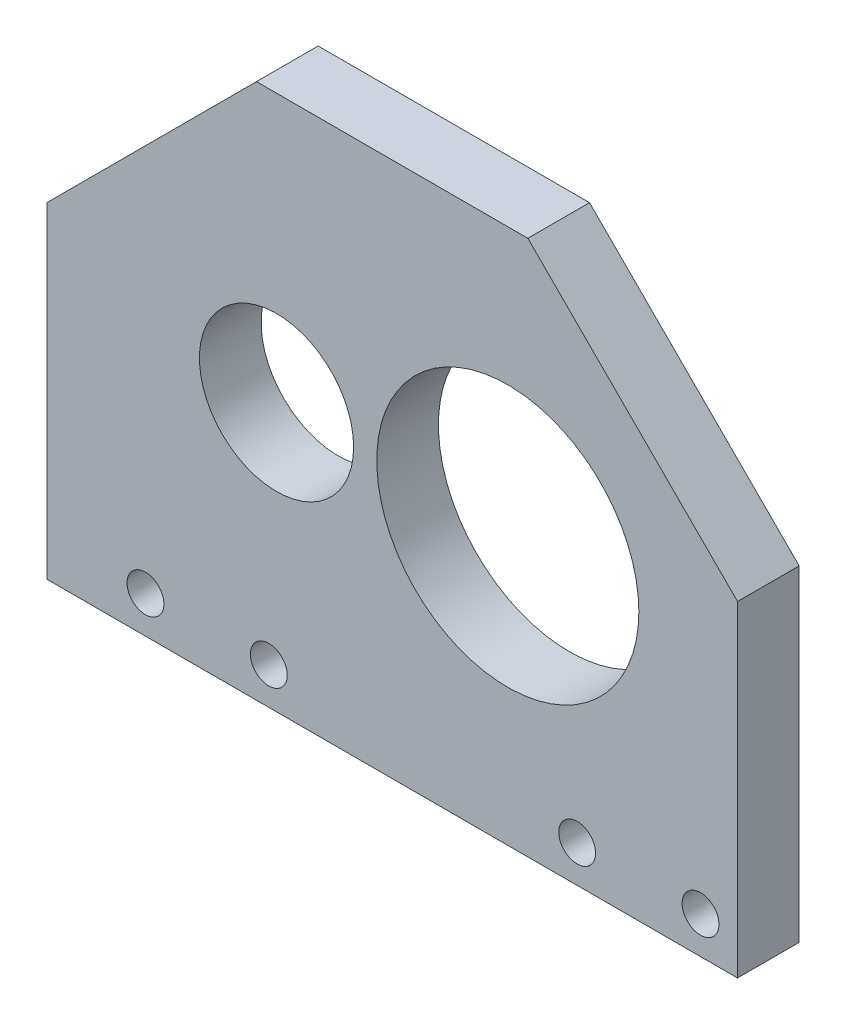
ISO-10303-21;
HEADER;
FILE_DESCRIPTION(('STEP AP214'),'2;1');
FILE_NAME('part.step','',(''),(''),'','','');
FILE_SCHEMA(('AUTOMOTIVE_DESIGN { 1 0 10303 214 1 1 1 1 }'));
ENDSEC;
DATA;
#1=APPLICATION_CONTEXT('core data for automotive mechanical design processes');
#2=APPLICATION_PROTOCOL_DEFINITION('international standard','automotive_design',2000,#1);
#3=PRODUCT_CONTEXT('',#1,'mechanical');
#4=PRODUCT('Part','Part','',(#3));
#5=PRODUCT_RELATED_PRODUCT_CATEGORY('part','',(#4));
#6=PRODUCT_DEFINITION_FORMATION('','',#4);
#7=PRODUCT_DEFINITION_CONTEXT('part definition',#1,'design');
#8=PRODUCT_DEFINITION('design','',#6,#7);
#9=PRODUCT_DEFINITION_SHAPE('','',#8);
#10=(LENGTH_UNIT() NAMED_UNIT(*) SI_UNIT(.MILLI.,.METRE.));
#11=(NAMED_UNIT(*) PLANE_ANGLE_UNIT() SI_UNIT($,.RADIAN.));
#12=(NAMED_UNIT(*) SI_UNIT($,.STERADIAN.) SOLID_ANGLE_UNIT());
#13=UNCERTAINTY_MEASURE_WITH_UNIT(LENGTH_MEASURE(1.E-05),#10,'distance_accuracy_value','');
#14=(GEOMETRIC_REPRESENTATION_CONTEXT(3) GLOBAL_UNCERTAINTY_ASSIGNED_CONTEXT((#13)) GLOBAL_UNIT_ASSIGNED_CONTEXT((#10,
#11,#12)) REPRESENTATION_CONTEXT('',''));
#15=CARTESIAN_POINT('',(0.,0.,0.));
#16=DIRECTION('',(0.,0.,1.));
#17=DIRECTION('',(1.,0.,0.));
#18=AXIS2_PLACEMENT_3D('',#15,#16,#17);
#19=CARTESIAN_POINT('',(0.,0.,6.35));
#20=DIRECTION('',(0.,0.,1.));
#21=DIRECTION('',(1.,0.,0.));
#22=AXIS2_PLACEMENT_3D('',#19,#20,#21);
#23=PLANE('',#22);
#24=DIRECTION('',(0.707106781186548,-0.707106781186548,0.));
#25=VECTOR('',#24,1.);
#26=CARTESIAN_POINT('',(35.56,5.99186000000002,6.35));
#27=LINE('',#26,#25);
#28=CARTESIAN_POINT('',(13.97,27.58186,6.35));
#29=VERTEX_POINT('',#28);
#30=CARTESIAN_POINT('',(35.56,5.99186000000002,6.35));
#31=VERTEX_POINT('',#30);
#32=EDGE_CURVE('E88',#29,#31,#27,.T.);
#33=ORIENTED_EDGE('',*,*,#32,.F.);
#34=DIRECTION('',(-1.,0.,0.));
#35=VECTOR('',#34,1.);
#36=CARTESIAN_POINT('',(35.56,27.58186,6.35));
#37=LINE('',#36,#35);
#38=CARTESIAN_POINT('',(-13.97,27.58186,6.35));
#39=VERTEX_POINT('',#38);
#40=EDGE_CURVE('E56',#29,#39,#37,.T.);
#41=ORIENTED_EDGE('',*,*,#40,.T.);
#42=DIRECTION('',(0.707106781186547,0.707106781186548,0.));
#43=VECTOR('',#42,1.);
#44=CARTESIAN_POINT('',(-35.56,5.99186000000001,6.35));
#45=LINE('',#44,#43);
#46=CARTESIAN_POINT('',(-35.56,5.99186000000001,6.35));
#47=VERTEX_POINT('',#46);
#48=EDGE_CURVE('E93',#47,#39,#45,.T.);
#49=ORIENTED_EDGE('',*,*,#48,.F.);
#50=DIRECTION('',(0.,-1.,0.));
#51=VECTOR('',#50,1.);
#52=CARTESIAN_POINT('',(-35.56,-27.58186,6.35));
#53=LINE('',#52,#51);
#54=CARTESIAN_POINT('',(-35.56,-27.58186,6.35));
#55=VERTEX_POINT('',#54);
#56=EDGE_CURVE('E111',#47,#55,#53,.T.);
#57=ORIENTED_EDGE('',*,*,#56,.T.);
#58=DIRECTION('',(1.,0.,0.));
#59=VECTOR('',#58,1.);
#60=CARTESIAN_POINT('',(35.56,-27.58186,6.35));
#61=LINE('',#60,#59);
#62=CARTESIAN_POINT('',(35.56,-27.58186,6.35));
#63=VERTEX_POINT('',#62);
#64=EDGE_CURVE('E118',#55,#63,#61,.T.);
#65=ORIENTED_EDGE('',*,*,#64,.T.);
#66=DIRECTION('',(0.,1.,0.));
#67=VECTOR('',#66,1.);
#68=CARTESIAN_POINT('',(35.56,-27.58186,6.35));
#69=LINE('',#68,#67);
#70=EDGE_CURVE('E116',#63,#31,#69,.T.);
#71=ORIENTED_EDGE('',*,*,#70,.T.);
#72=EDGE_LOOP('',(#33,#41,#49,#57,#65,#71));
#73=FACE_BOUND('',#72,.T.);
#74=CARTESIAN_POINT('',(-25.4,-23.77186,6.35));
#75=DIRECTION('',(0.,0.,1.));
#76=DIRECTION('',(1.,0.,0.));
#77=AXIS2_PLACEMENT_3D('',#74,#75,#76);
#78=CIRCLE('',#77,1.89864999999999);
#79=CARTESIAN_POINT('',(-23.50135,-23.77186,6.35));
#80=VERTEX_POINT('',#79);
#81=EDGE_CURVE('E154',#80,#80,#78,.T.);
#82=ORIENTED_EDGE('',*,*,#81,.F.);
#83=EDGE_LOOP('',(#82));
#84=FACE_BOUND('',#83,.T.);
#85=CARTESIAN_POINT('',(-12.7,-23.77186,6.35));
#86=DIRECTION('',(0.,0.,1.));
#87=DIRECTION('',(1.,0.,0.));
#88=AXIS2_PLACEMENT_3D('',#85,#86,#87);
#89=CIRCLE('',#88,1.89864999999999);
#90=CARTESIAN_POINT('',(-10.80135,-23.77186,6.35));
#91=VERTEX_POINT('',#90);
#92=EDGE_CURVE('E161',#91,#91,#89,.T.);
#93=ORIENTED_EDGE('',*,*,#92,.F.);
#94=EDGE_LOOP('',(#93));
#95=FACE_BOUND('',#94,.T.);
#96=CARTESIAN_POINT('',(19.05,-23.77186,6.35));
#97=DIRECTION('',(0.,0.,1.));
#98=DIRECTION('',(1.,0.,0.));
#99=AXIS2_PLACEMENT_3D('',#96,#97,#98);
#100=CIRCLE('',#99,1.89864999999999);
#101=CARTESIAN_POINT('',(20.94865,-23.77186,6.35));
#102=VERTEX_POINT('',#101);
#103=EDGE_CURVE('E167',#102,#102,#100,.T.);
#104=ORIENTED_EDGE('',*,*,#103,.F.);
#105=EDGE_LOOP('',(#104));
#106=FACE_BOUND('',#105,.T.);
#107=CARTESIAN_POINT('',(31.75,-23.77186,6.35));
#108=DIRECTION('',(0.,0.,1.));
#109=DIRECTION('',(1.,0.,0.));
#110=AXIS2_PLACEMENT_3D('',#107,#108,#109);
#111=CIRCLE('',#110,1.89864999999999);
#112=CARTESIAN_POINT('',(33.64865,-23.77186,6.35));
#113=VERTEX_POINT('',#112);
#114=EDGE_CURVE('E173',#113,#113,#111,.T.);
#115=ORIENTED_EDGE('',*,*,#114,.F.);
#116=EDGE_LOOP('',(#115));
#117=FACE_BOUND('',#116,.T.);
#118=CARTESIAN_POINT('',(11.90625,0.,6.35));
#119=DIRECTION('',(0.,0.,1.));
#120=DIRECTION('',(1.,0.,0.));
#121=AXIS2_PLACEMENT_3D('',#118,#119,#120);
#122=CIRCLE('',#121,13.49375);
#123=CARTESIAN_POINT('',(25.4,0.,6.35));
#124=VERTEX_POINT('',#123);
#125=EDGE_CURVE('E121',#124,#124,#122,.T.);
#126=ORIENTED_EDGE('',*,*,#125,.F.);
#127=EDGE_LOOP('',(#126));
#128=FACE_BOUND('',#127,.T.);
#129=CARTESIAN_POINT('',(-11.90625,0.,6.35));
#130=DIRECTION('',(0.,0.,1.));
#131=DIRECTION('',(1.,0.,0.));
#132=AXIS2_PLACEMENT_3D('',#129,#130,#131);
#133=CIRCLE('',#132,7.9375);
#134=CARTESIAN_POINT('',(-3.96875,0.,6.35));
#135=VERTEX_POINT('',#134);
#136=EDGE_CURVE('E132',#135,#135,#133,.T.);
#137=ORIENTED_EDGE('',*,*,#136,.F.);
#138=EDGE_LOOP('',(#137));
#139=FACE_BOUND('',#138,.T.);
#140=ADVANCED_FACE('F33',(#73,#84,#95,#106,#117,#128,#139),#23,.T.);
#141=CARTESIAN_POINT('',(0.,0.,0.));
#142=DIRECTION('',(0.,0.,1.));
#143=DIRECTION('',(1.,0.,0.));
#144=AXIS2_PLACEMENT_3D('',#141,#142,#143);
#145=PLANE('',#144);
#146=CARTESIAN_POINT('',(-25.4,-23.77186,0.));
#147=DIRECTION('',(0.,0.,1.));
#148=DIRECTION('',(1.,0.,0.));
#149=AXIS2_PLACEMENT_3D('',#146,#147,#148);
#150=CIRCLE('',#149,1.89864999999999);
#151=CARTESIAN_POINT('',(-23.50135,-23.77186,0.));
#152=VERTEX_POINT('',#151);
#153=EDGE_CURVE('E158',#152,#152,#150,.T.);
#154=ORIENTED_EDGE('',*,*,#153,.T.);
#155=EDGE_LOOP('',(#154));
#156=FACE_BOUND('',#155,.T.);
#157=CARTESIAN_POINT('',(-12.7,-23.77186,0.));
#158=DIRECTION('',(0.,0.,1.));
#159=DIRECTION('',(1.,0.,0.));
#160=AXIS2_PLACEMENT_3D('',#157,#158,#159);
#161=CIRCLE('',#160,1.89864999999999);
#162=CARTESIAN_POINT('',(-10.80135,-23.77186,0.));
#163=VERTEX_POINT('',#162);
#164=EDGE_CURVE('E164',#163,#163,#161,.T.);
#165=ORIENTED_EDGE('',*,*,#164,.T.);
#166=EDGE_LOOP('',(#165));
#167=FACE_BOUND('',#166,.T.);
#168=CARTESIAN_POINT('',(19.05,-23.77186,0.));
#169=DIRECTION('',(0.,0.,1.));
#170=DIRECTION('',(1.,0.,0.));
#171=AXIS2_PLACEMENT_3D('',#168,#169,#170);
#172=CIRCLE('',#171,1.89864999999999);
#173=CARTESIAN_POINT('',(20.94865,-23.77186,0.));
#174=VERTEX_POINT('',#173);
#175=EDGE_CURVE('E170',#174,#174,#172,.T.);
#176=ORIENTED_EDGE('',*,*,#175,.T.);
#177=EDGE_LOOP('',(#176));
#178=FACE_BOUND('',#177,.T.);
#179=CARTESIAN_POINT('',(31.75,-23.77186,0.));
#180=DIRECTION('',(0.,0.,1.));
#181=DIRECTION('',(1.,0.,0.));
#182=AXIS2_PLACEMENT_3D('',#179,#180,#181);
#183=CIRCLE('',#182,1.89864999999999);
#184=CARTESIAN_POINT('',(33.64865,-23.77186,0.));
#185=VERTEX_POINT('',#184);
#186=EDGE_CURVE('E176',#185,#185,#183,.T.);
#187=ORIENTED_EDGE('',*,*,#186,.T.);
#188=EDGE_LOOP('',(#187));
#189=FACE_BOUND('',#188,.T.);
#190=DIRECTION('',(-1.,0.,0.));
#191=VECTOR('',#190,1.);
#192=CARTESIAN_POINT('',(35.56,27.58186,0.));
#193=LINE('',#192,#191);
#194=CARTESIAN_POINT('',(13.97,27.58186,0.));
#195=VERTEX_POINT('',#194);
#196=CARTESIAN_POINT('',(-13.97,27.58186,0.));
#197=VERTEX_POINT('',#196);
#198=EDGE_CURVE('E104',#195,#197,#193,.T.);
#199=ORIENTED_EDGE('',*,*,#198,.F.);
#200=DIRECTION('',(0.707106781186548,-0.707106781186548,0.));
#201=VECTOR('',#200,1.);
#202=CARTESIAN_POINT('',(35.56,5.99186000000002,0.));
#203=LINE('',#202,#201);
#204=CARTESIAN_POINT('',(35.56,5.99186000000002,0.));
#205=VERTEX_POINT('',#204);
#206=EDGE_CURVE('E48',#195,#205,#203,.T.);
#207=ORIENTED_EDGE('',*,*,#206,.T.);
#208=DIRECTION('',(0.,1.,0.));
#209=VECTOR('',#208,1.);
#210=CARTESIAN_POINT('',(35.56,-27.58186,0.));
#211=LINE('',#210,#209);
#212=CARTESIAN_POINT('',(35.56,-27.58186,0.));
#213=VERTEX_POINT('',#212);
#214=EDGE_CURVE('E102',#213,#205,#211,.T.);
#215=ORIENTED_EDGE('',*,*,#214,.F.);
#216=DIRECTION('',(1.,0.,0.));
#217=VECTOR('',#216,1.);
#218=CARTESIAN_POINT('',(35.56,-27.58186,0.));
#219=LINE('',#218,#217);
#220=CARTESIAN_POINT('',(-35.56,-27.58186,0.));
#221=VERTEX_POINT('',#220);
#222=EDGE_CURVE('E109',#221,#213,#219,.T.);
#223=ORIENTED_EDGE('',*,*,#222,.F.);
#224=DIRECTION('',(0.,-1.,0.));
#225=VECTOR('',#224,1.);
#226=CARTESIAN_POINT('',(-35.56,-27.58186,0.));
#227=LINE('',#226,#225);
#228=CARTESIAN_POINT('',(-35.56,5.99186000000001,0.));
#229=VERTEX_POINT('',#228);
#230=EDGE_CURVE('E113',#229,#221,#227,.T.);
#231=ORIENTED_EDGE('',*,*,#230,.F.);
#232=DIRECTION('',(0.707106781186547,0.707106781186548,0.));
#233=VECTOR('',#232,1.);
#234=CARTESIAN_POINT('',(-35.56,5.99186000000001,0.));
#235=LINE('',#234,#233);
#236=EDGE_CURVE('E143',#229,#197,#235,.T.);
#237=ORIENTED_EDGE('',*,*,#236,.T.);
#238=EDGE_LOOP('',(#199,#207,#215,#223,#231,#237));
#239=FACE_BOUND('',#238,.T.);
#240=CARTESIAN_POINT('',(11.90625,0.,0.));
#241=DIRECTION('',(0.,0.,1.));
#242=DIRECTION('',(1.,0.,0.));
#243=AXIS2_PLACEMENT_3D('',#240,#241,#242);
#244=CIRCLE('',#243,13.49375);
#245=CARTESIAN_POINT('',(25.4,0.,0.));
#246=VERTEX_POINT('',#245);
#247=EDGE_CURVE('E127',#246,#246,#244,.T.);
#248=ORIENTED_EDGE('',*,*,#247,.T.);
#249=EDGE_LOOP('',(#248));
#250=FACE_BOUND('',#249,.T.);
#251=CARTESIAN_POINT('',(-11.90625,0.,0.));
#252=DIRECTION('',(0.,0.,1.));
#253=DIRECTION('',(1.,0.,0.));
#254=AXIS2_PLACEMENT_3D('',#251,#252,#253);
#255=CIRCLE('',#254,7.9375);
#256=CARTESIAN_POINT('',(-3.96875,0.,0.));
#257=VERTEX_POINT('',#256);
#258=EDGE_CURVE('E135',#257,#257,#255,.T.);
#259=ORIENTED_EDGE('',*,*,#258,.T.);
#260=EDGE_LOOP('',(#259));
#261=FACE_BOUND('',#260,.T.);
#262=ADVANCED_FACE('F99',(#156,#167,#178,#189,#239,#250,#261),#145,.F.);
#263=CARTESIAN_POINT('',(-35.56,-27.58186,6.35));
#264=DIRECTION('',(1.,0.,0.));
#265=DIRECTION('',(0.,0.,-1.));
#266=AXIS2_PLACEMENT_3D('',#263,#264,#265);
#267=PLANE('',#266);
#268=ORIENTED_EDGE('',*,*,#56,.F.);
#269=DIRECTION('',(0.,0.,1.));
#270=VECTOR('',#269,1.);
#271=CARTESIAN_POINT('',(-35.56,5.99186000000001,0.));
#272=LINE('',#271,#270);
#273=EDGE_CURVE('E146',#229,#47,#272,.T.);
#274=ORIENTED_EDGE('',*,*,#273,.F.);
#275=ORIENTED_EDGE('',*,*,#230,.T.);
#276=DIRECTION('',(0.,0.,-1.));
#277=VECTOR('',#276,1.);
#278=CARTESIAN_POINT('',(-35.56,-27.58186,6.35));
#279=LINE('',#278,#277);
#280=EDGE_CURVE('E11',#55,#221,#279,.T.);
#281=ORIENTED_EDGE('',*,*,#280,.F.);
#282=EDGE_LOOP('',(#268,#274,#275,#281));
#283=FACE_BOUND('',#282,.T.);
#284=ADVANCED_FACE('F35',(#283),#267,.F.);
#285=CARTESIAN_POINT('',(35.56,-27.58186,6.35));
#286=DIRECTION('',(0.,1.,0.));
#287=DIRECTION('',(-1.,0.,0.));
#288=AXIS2_PLACEMENT_3D('',#285,#286,#287);
#289=PLANE('',#288);
#290=ORIENTED_EDGE('',*,*,#222,.T.);
#291=DIRECTION('',(0.,0.,-1.));
#292=VECTOR('',#291,1.);
#293=CARTESIAN_POINT('',(35.56,-27.58186,6.35));
#294=LINE('',#293,#292);
#295=EDGE_CURVE('E41',#63,#213,#294,.T.);
#296=ORIENTED_EDGE('',*,*,#295,.F.);
#297=ORIENTED_EDGE('',*,*,#64,.F.);
#298=ORIENTED_EDGE('',*,*,#280,.T.);
#299=EDGE_LOOP('',(#290,#296,#297,#298));
#300=FACE_BOUND('',#299,.T.);
#301=ADVANCED_FACE('F142',(#300),#289,.F.);
#302=CARTESIAN_POINT('',(35.56,-27.58186,6.35));
#303=DIRECTION('',(-1.,0.,0.));
#304=DIRECTION('',(0.,0.,1.));
#305=AXIS2_PLACEMENT_3D('',#302,#303,#304);
#306=PLANE('',#305);
#307=ORIENTED_EDGE('',*,*,#214,.T.);
#308=DIRECTION('',(0.,0.,1.));
#309=VECTOR('',#308,1.);
#310=CARTESIAN_POINT('',(35.56,5.99186000000002,0.));
#311=LINE('',#310,#309);
#312=EDGE_CURVE('E86',#205,#31,#311,.T.);
#313=ORIENTED_EDGE('',*,*,#312,.T.);
#314=ORIENTED_EDGE('',*,*,#70,.F.);
#315=ORIENTED_EDGE('',*,*,#295,.T.);
#316=EDGE_LOOP('',(#307,#313,#314,#315));
#317=FACE_BOUND('',#316,.T.);
#318=ADVANCED_FACE('F107',(#317),#306,.F.);
#319=CARTESIAN_POINT('',(35.56,27.58186,6.35));
#320=DIRECTION('',(0.,-1.,0.));
#321=DIRECTION('',(1.,0.,0.));
#322=AXIS2_PLACEMENT_3D('',#319,#320,#321);
#323=PLANE('',#322);
#324=ORIENTED_EDGE('',*,*,#40,.F.);
#325=DIRECTION('',(0.,0.,1.));
#326=VECTOR('',#325,1.);
#327=CARTESIAN_POINT('',(13.97,27.58186,0.));
#328=LINE('',#327,#326);
#329=EDGE_CURVE('E94',#195,#29,#328,.T.);
#330=ORIENTED_EDGE('',*,*,#329,.F.);
#331=ORIENTED_EDGE('',*,*,#198,.T.);
#332=DIRECTION('',(0.,0.,1.));
#333=VECTOR('',#332,1.);
#334=CARTESIAN_POINT('',(-13.97,27.58186,0.));
#335=LINE('',#334,#333);
#336=EDGE_CURVE('E148',#197,#39,#335,.T.);
#337=ORIENTED_EDGE('',*,*,#336,.T.);
#338=EDGE_LOOP('',(#324,#330,#331,#337));
#339=FACE_BOUND('',#338,.T.);
#340=ADVANCED_FACE('F197',(#339),#323,.F.);
#341=CARTESIAN_POINT('',(11.90625,0.,6.35));
#342=DIRECTION('',(0.,0.,-1.));
#343=DIRECTION('',(-1.,0.,0.));
#344=AXIS2_PLACEMENT_3D('',#341,#342,#343);
#345=CYLINDRICAL_SURFACE('',#344,13.49375);
#346=ORIENTED_EDGE('',*,*,#125,.T.);
#347=EDGE_LOOP('',(#346));
#348=FACE_BOUND('',#347,.T.);
#349=ORIENTED_EDGE('',*,*,#247,.F.);
#350=EDGE_LOOP('',(#349));
#351=FACE_BOUND('',#350,.T.);
#352=ADVANCED_FACE('F188',(#348,#351),#345,.F.);
#353=CARTESIAN_POINT('',(-11.90625,0.,6.35));
#354=DIRECTION('',(0.,0.,-1.));
#355=DIRECTION('',(-1.,0.,0.));
#356=AXIS2_PLACEMENT_3D('',#353,#354,#355);
#357=CYLINDRICAL_SURFACE('',#356,7.9375);
#358=ORIENTED_EDGE('',*,*,#136,.T.);
#359=EDGE_LOOP('',(#358));
#360=FACE_BOUND('',#359,.T.);
#361=ORIENTED_EDGE('',*,*,#258,.F.);
#362=EDGE_LOOP('',(#361));
#363=FACE_BOUND('',#362,.T.);
#364=ADVANCED_FACE('F185',(#360,#363),#357,.F.);
#365=CARTESIAN_POINT('',(31.75,-23.77186,6.35));
#366=DIRECTION('',(0.,0.,1.));
#367=DIRECTION('',(1.,0.,0.));
#368=AXIS2_PLACEMENT_3D('',#365,#366,#367);
#369=CYLINDRICAL_SURFACE('',#368,1.89864999999999);
#370=ORIENTED_EDGE('',*,*,#186,.F.);
#371=EDGE_LOOP('',(#370));
#372=FACE_BOUND('',#371,.T.);
#373=ORIENTED_EDGE('',*,*,#114,.T.);
#374=EDGE_LOOP('',(#373));
#375=FACE_BOUND('',#374,.T.);
#376=ADVANCED_FACE('F187',(#372,#375),#369,.F.);
#377=CARTESIAN_POINT('',(19.05,-23.77186,6.35));
#378=DIRECTION('',(0.,0.,1.));
#379=DIRECTION('',(1.,0.,0.));
#380=AXIS2_PLACEMENT_3D('',#377,#378,#379);
#381=CYLINDRICAL_SURFACE('',#380,1.89864999999999);
#382=ORIENTED_EDGE('',*,*,#175,.F.);
#383=EDGE_LOOP('',(#382));
#384=FACE_BOUND('',#383,.T.);
#385=ORIENTED_EDGE('',*,*,#103,.T.);
#386=EDGE_LOOP('',(#385));
#387=FACE_BOUND('',#386,.T.);
#388=ADVANCED_FACE('F194',(#384,#387),#381,.F.);
#389=CARTESIAN_POINT('',(-12.7,-23.77186,6.35));
#390=DIRECTION('',(0.,0.,1.));
#391=DIRECTION('',(1.,0.,0.));
#392=AXIS2_PLACEMENT_3D('',#389,#390,#391);
#393=CYLINDRICAL_SURFACE('',#392,1.89864999999999);
#394=ORIENTED_EDGE('',*,*,#164,.F.);
#395=EDGE_LOOP('',(#394));
#396=FACE_BOUND('',#395,.T.);
#397=ORIENTED_EDGE('',*,*,#92,.T.);
#398=EDGE_LOOP('',(#397));
#399=FACE_BOUND('',#398,.T.);
#400=ADVANCED_FACE('F227',(#396,#399),#393,.F.);
#401=CARTESIAN_POINT('',(-25.4,-23.77186,6.35));
#402=DIRECTION('',(0.,0.,1.));
#403=DIRECTION('',(1.,0.,0.));
#404=AXIS2_PLACEMENT_3D('',#401,#402,#403);
#405=CYLINDRICAL_SURFACE('',#404,1.89864999999999);
#406=ORIENTED_EDGE('',*,*,#153,.F.);
#407=EDGE_LOOP('',(#406));
#408=FACE_BOUND('',#407,.T.);
#409=ORIENTED_EDGE('',*,*,#81,.T.);
#410=EDGE_LOOP('',(#409));
#411=FACE_BOUND('',#410,.T.);
#412=ADVANCED_FACE('F220',(#408,#411),#405,.F.);
#413=CARTESIAN_POINT('',(-35.56,5.99186000000001,0.));
#414=DIRECTION('',(0.707106781186548,-0.707106781186547,0.));
#415=DIRECTION('',(0.707106781186547,0.707106781186548,0.));
#416=AXIS2_PLACEMENT_3D('',#413,#414,#415);
#417=PLANE('',#416);
#418=ORIENTED_EDGE('',*,*,#48,.T.);
#419=ORIENTED_EDGE('',*,*,#336,.F.);
#420=ORIENTED_EDGE('',*,*,#236,.F.);
#421=ORIENTED_EDGE('',*,*,#273,.T.);
#422=EDGE_LOOP('',(#418,#419,#420,#421));
#423=FACE_BOUND('',#422,.T.);
#424=ADVANCED_FACE('F217',(#423),#417,.F.);
#425=CARTESIAN_POINT('',(35.56,5.99186000000002,0.));
#426=DIRECTION('',(-0.707106781186547,-0.707106781186548,0.));
#427=DIRECTION('',(0.707106781186548,-0.707106781186547,0.));
#428=AXIS2_PLACEMENT_3D('',#425,#426,#427);
#429=PLANE('',#428);
#430=ORIENTED_EDGE('',*,*,#32,.T.);
#431=ORIENTED_EDGE('',*,*,#312,.F.);
#432=ORIENTED_EDGE('',*,*,#206,.F.);
#433=ORIENTED_EDGE('',*,*,#329,.T.);
#434=EDGE_LOOP('',(#430,#431,#432,#433));
#435=FACE_BOUND('',#434,.T.);
#436=ADVANCED_FACE('F87',(#435),#429,.F.);
#437=CLOSED_SHELL('',(#140,#262,#284,#301,#318,#340,#352,#364,#376,#388,#400,#412,#424,#436));
#438=MANIFOLD_SOLID_BREP('B2',#437);
#439=ADVANCED_BREP_SHAPE_REPRESENTATION('',(#18,#438),#14);
#440=SHAPE_DEFINITION_REPRESENTATION(#9,#439);
ENDSEC;
END-ISO-10303-21;
